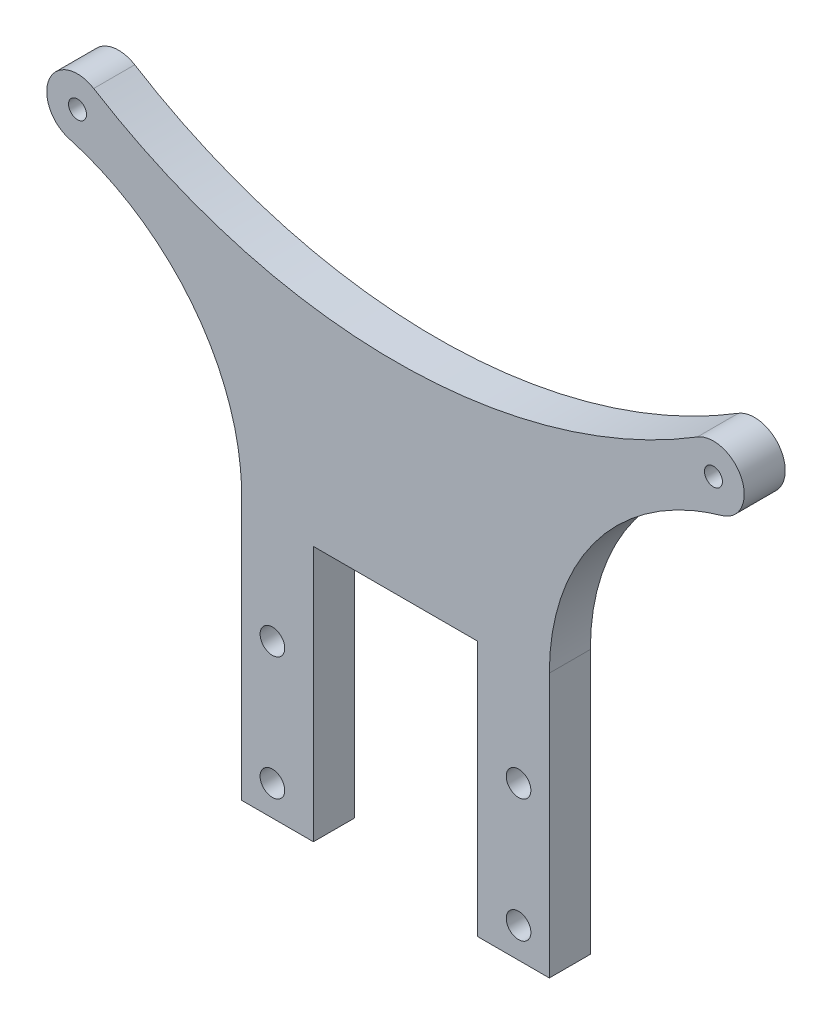
ISO-10303-21;
HEADER;
FILE_DESCRIPTION(('STEP AP214'),'2;1');
FILE_NAME('part.step','',(''),(''),'','','');
FILE_SCHEMA(('AUTOMOTIVE_DESIGN { 1 0 10303 214 1 1 1 1 }'));
ENDSEC;
DATA;
#1=APPLICATION_CONTEXT('core data for automotive mechanical design processes');
#2=APPLICATION_PROTOCOL_DEFINITION('international standard','automotive_design',2000,#1);
#3=PRODUCT_CONTEXT('',#1,'mechanical');
#4=PRODUCT('Part','Part','',(#3));
#5=PRODUCT_RELATED_PRODUCT_CATEGORY('part','',(#4));
#6=PRODUCT_DEFINITION_FORMATION('','',#4);
#7=PRODUCT_DEFINITION_CONTEXT('part definition',#1,'design');
#8=PRODUCT_DEFINITION('design','',#6,#7);
#9=PRODUCT_DEFINITION_SHAPE('','',#8);
#10=(LENGTH_UNIT() NAMED_UNIT(*) SI_UNIT(.MILLI.,.METRE.));
#11=(NAMED_UNIT(*) PLANE_ANGLE_UNIT() SI_UNIT($,.RADIAN.));
#12=(NAMED_UNIT(*) SI_UNIT($,.STERADIAN.) SOLID_ANGLE_UNIT());
#13=UNCERTAINTY_MEASURE_WITH_UNIT(LENGTH_MEASURE(1.E-05),#10,'distance_accuracy_value','');
#14=(GEOMETRIC_REPRESENTATION_CONTEXT(3) GLOBAL_UNCERTAINTY_ASSIGNED_CONTEXT((#13)) GLOBAL_UNIT_ASSIGNED_CONTEXT((#10,
#11,#12)) REPRESENTATION_CONTEXT('',''));
#15=CARTESIAN_POINT('',(0.,0.,0.));
#16=DIRECTION('',(0.,0.,1.));
#17=DIRECTION('',(1.,0.,0.));
#18=AXIS2_PLACEMENT_3D('',#15,#16,#17);
#19=CARTESIAN_POINT('',(-60.8178296691344,1.27,6.35));
#20=DIRECTION('',(0.,0.,-1.));
#21=DIRECTION('',(-1.,0.,0.));
#22=AXIS2_PLACEMENT_3D('',#19,#20,#21);
#23=PLANE('',#22);
#24=CARTESIAN_POINT('',(19.05,-34.925,6.35));
#25=DIRECTION('',(0.,0.,1.));
#26=DIRECTION('',(-1.,0.,0.));
#27=AXIS2_PLACEMENT_3D('',#24,#25,#26);
#28=CIRCLE('',#27,1.90499999999999);
#29=CARTESIAN_POINT('',(17.145,-34.925,6.35));
#30=VERTEX_POINT('',#29);
#31=EDGE_CURVE('E315',#30,#30,#28,.T.);
#32=ORIENTED_EDGE('',*,*,#31,.F.);
#33=EDGE_LOOP('',(#32));
#34=FACE_BOUND('',#33,.T.);
#35=CARTESIAN_POINT('',(-49.2125,40.3225,6.35));
#36=DIRECTION('',(0.,0.,1.));
#37=DIRECTION('',(1.,0.,0.));
#38=AXIS2_PLACEMENT_3D('',#35,#36,#37);
#39=CIRCLE('',#38,1.3890625);
#40=CARTESIAN_POINT('',(-47.8234375,40.3225,6.35));
#41=VERTEX_POINT('',#40);
#42=EDGE_CURVE('E303',#41,#41,#39,.T.);
#43=ORIENTED_EDGE('',*,*,#42,.F.);
#44=EDGE_LOOP('',(#43));
#45=FACE_BOUND('',#44,.T.);
#46=CARTESIAN_POINT('',(-19.05,-15.875,6.35));
#47=DIRECTION('',(0.,0.,1.));
#48=DIRECTION('',(1.,0.,0.));
#49=AXIS2_PLACEMENT_3D('',#46,#47,#48);
#50=CIRCLE('',#49,1.905);
#51=CARTESIAN_POINT('',(-17.145,-15.875,6.35));
#52=VERTEX_POINT('',#51);
#53=EDGE_CURVE('E159',#52,#52,#50,.T.);
#54=ORIENTED_EDGE('',*,*,#53,.F.);
#55=EDGE_LOOP('',(#54));
#56=FACE_BOUND('',#55,.T.);
#57=DIRECTION('',(0.,1.,0.));
#58=VECTOR('',#57,1.);
#59=CARTESIAN_POINT('',(-12.7,0.,6.35));
#60=LINE('',#59,#58);
#61=CARTESIAN_POINT('',(-12.7,-39.5938606465336,6.35));
#62=VERTEX_POINT('',#61);
#63=CARTESIAN_POINT('',(-12.7,0.,6.35));
#64=VERTEX_POINT('',#63);
#65=EDGE_CURVE('E179',#62,#64,#60,.T.);
#66=ORIENTED_EDGE('',*,*,#65,.T.);
#67=DIRECTION('',(1.,0.,0.));
#68=VECTOR('',#67,1.);
#69=CARTESIAN_POINT('',(12.7,0.,6.35));
#70=LINE('',#69,#68);
#71=CARTESIAN_POINT('',(12.7,0.,6.35));
#72=VERTEX_POINT('',#71);
#73=EDGE_CURVE('E105',#64,#72,#70,.T.);
#74=ORIENTED_EDGE('',*,*,#73,.T.);
#75=DIRECTION('',(0.,-1.,0.));
#76=VECTOR('',#75,1.);
#77=CARTESIAN_POINT('',(12.7,0.,6.35));
#78=LINE('',#77,#76);
#79=CARTESIAN_POINT('',(12.7,-39.5938606465336,6.35));
#80=VERTEX_POINT('',#79);
#81=EDGE_CURVE('E206',#72,#80,#78,.T.);
#82=ORIENTED_EDGE('',*,*,#81,.T.);
#83=DIRECTION('',(1.,0.,0.));
#84=VECTOR('',#83,1.);
#85=CARTESIAN_POINT('',(23.8125,-39.5938606465336,6.35));
#86=LINE('',#85,#84);
#87=CARTESIAN_POINT('',(23.8125,-39.5938606465336,6.35));
#88=VERTEX_POINT('',#87);
#89=EDGE_CURVE('E224',#80,#88,#86,.T.);
#90=ORIENTED_EDGE('',*,*,#89,.T.);
#91=DIRECTION('',(0.,1.,0.));
#92=VECTOR('',#91,1.);
#93=CARTESIAN_POINT('',(23.8125,-39.5938606465336,6.35));
#94=LINE('',#93,#92);
#95=CARTESIAN_POINT('',(23.8125,1.27000000000002,6.35));
#96=VERTEX_POINT('',#95);
#97=EDGE_CURVE('E221',#88,#96,#94,.T.);
#98=ORIENTED_EDGE('',*,*,#97,.T.);
#99=CARTESIAN_POINT('',(60.8178296691344,1.27000000000003,6.35));
#100=DIRECTION('',(0.,0.,-1.));
#101=DIRECTION('',(-1.,0.,0.));
#102=AXIS2_PLACEMENT_3D('',#99,#100,#101);
#103=ELLIPSE('',#102,37.0053296691344,35.8906348104381);
#104=CARTESIAN_POINT('',(50.5029869280307,35.7381734694634,6.35));
#105=VERTEX_POINT('',#104);
#106=EDGE_CURVE('E223',#96,#105,#103,.T.);
#107=ORIENTED_EDGE('',*,*,#106,.T.);
#108=CARTESIAN_POINT('',(49.2125,40.3225,6.35));
#109=DIRECTION('',(0.,0.,1.));
#110=DIRECTION('',(-1.,0.,0.));
#111=AXIS2_PLACEMENT_3D('',#108,#109,#110);
#112=CIRCLE('',#111,4.76250000000001);
#113=CARTESIAN_POINT('',(46.7102658795886,44.3746883787219,6.35));
#114=VERTEX_POINT('',#113);
#115=EDGE_CURVE('E226',#105,#114,#112,.T.);
#116=ORIENTED_EDGE('',*,*,#115,.T.);
#117=CARTESIAN_POINT('',(0.,120.018607954545,6.35));
#118=DIRECTION('',(0.,0.,-1.));
#119=DIRECTION('',(-1.,0.,0.));
#120=AXIS2_PLACEMENT_3D('',#117,#118,#119);
#121=CIRCLE('',#120,88.9036079545454);
#122=CARTESIAN_POINT('',(-46.7102658795886,44.3746883787219,6.35));
#123=VERTEX_POINT('',#122);
#124=EDGE_CURVE('E490',#114,#123,#121,.T.);
#125=ORIENTED_EDGE('',*,*,#124,.T.);
#126=CARTESIAN_POINT('',(-49.2125,40.3225,6.35));
#127=DIRECTION('',(0.,0.,1.));
#128=DIRECTION('',(1.,0.,0.));
#129=AXIS2_PLACEMENT_3D('',#126,#127,#128);
#130=CIRCLE('',#129,4.76250000000002);
#131=CARTESIAN_POINT('',(-50.5029869280307,35.7381734694634,6.35));
#132=VERTEX_POINT('',#131);
#133=EDGE_CURVE('E136',#123,#132,#130,.T.);
#134=ORIENTED_EDGE('',*,*,#133,.T.);
#135=CARTESIAN_POINT('',(-60.8178296691344,1.27,6.35));
#136=DIRECTION('',(0.,0.,-1.));
#137=DIRECTION('',(1.,0.,0.));
#138=AXIS2_PLACEMENT_3D('',#135,#136,#137);
#139=ELLIPSE('',#138,37.0053296691344,35.8906348104381);
#140=CARTESIAN_POINT('',(-23.8125,1.27,6.35));
#141=VERTEX_POINT('',#140);
#142=EDGE_CURVE('E130',#132,#141,#139,.T.);
#143=ORIENTED_EDGE('',*,*,#142,.T.);
#144=DIRECTION('',(0.,-1.,0.));
#145=VECTOR('',#144,1.);
#146=CARTESIAN_POINT('',(-23.8125,-39.5938606465336,6.35));
#147=LINE('',#146,#145);
#148=CARTESIAN_POINT('',(-23.8125,-39.5938606465336,6.35));
#149=VERTEX_POINT('',#148);
#150=EDGE_CURVE('E134',#141,#149,#147,.T.);
#151=ORIENTED_EDGE('',*,*,#150,.T.);
#152=DIRECTION('',(1.,0.,0.));
#153=VECTOR('',#152,1.);
#154=CARTESIAN_POINT('',(-23.8125,-39.5938606465336,6.35));
#155=LINE('',#154,#153);
#156=EDGE_CURVE('E50',#149,#62,#155,.T.);
#157=ORIENTED_EDGE('',*,*,#156,.T.);
#158=EDGE_LOOP('',(#66,#74,#82,#90,#98,#107,#116,#125,#134,#143,#151,#157));
#159=FACE_BOUND('',#158,.T.);
#160=CARTESIAN_POINT('',(19.05,-15.875,6.35));
#161=DIRECTION('',(0.,0.,1.));
#162=DIRECTION('',(-1.,0.,0.));
#163=AXIS2_PLACEMENT_3D('',#160,#161,#162);
#164=CIRCLE('',#163,1.905);
#165=CARTESIAN_POINT('',(17.145,-15.875,6.35));
#166=VERTEX_POINT('',#165);
#167=EDGE_CURVE('E297',#166,#166,#164,.T.);
#168=ORIENTED_EDGE('',*,*,#167,.F.);
#169=EDGE_LOOP('',(#168));
#170=FACE_BOUND('',#169,.T.);
#171=CARTESIAN_POINT('',(-19.05,-34.925,6.35));
#172=DIRECTION('',(0.,0.,1.));
#173=DIRECTION('',(1.,0.,0.));
#174=AXIS2_PLACEMENT_3D('',#171,#172,#173);
#175=CIRCLE('',#174,1.905);
#176=CARTESIAN_POINT('',(-17.145,-34.925,6.35));
#177=VERTEX_POINT('',#176);
#178=EDGE_CURVE('E309',#177,#177,#175,.T.);
#179=ORIENTED_EDGE('',*,*,#178,.F.);
#180=EDGE_LOOP('',(#179));
#181=FACE_BOUND('',#180,.T.);
#182=CARTESIAN_POINT('',(49.2125,40.3225,6.35));
#183=DIRECTION('',(0.,0.,1.));
#184=DIRECTION('',(-1.,0.,0.));
#185=AXIS2_PLACEMENT_3D('',#182,#183,#184);
#186=CIRCLE('',#185,1.3890625);
#187=CARTESIAN_POINT('',(47.8234375,40.3225,6.35));
#188=VERTEX_POINT('',#187);
#189=EDGE_CURVE('E321',#188,#188,#186,.T.);
#190=ORIENTED_EDGE('',*,*,#189,.F.);
#191=EDGE_LOOP('',(#190));
#192=FACE_BOUND('',#191,.T.);
#193=ADVANCED_FACE('F33',(#34,#45,#56,#159,#170,#181,#192),#23,.F.);
#194=CARTESIAN_POINT('',(-60.8178296691344,1.27,0.));
#195=DIRECTION('',(0.,0.,-1.));
#196=DIRECTION('',(-1.,0.,0.));
#197=AXIS2_PLACEMENT_3D('',#194,#195,#196);
#198=PLANE('',#197);
#199=CARTESIAN_POINT('',(19.05,-34.925,0.));
#200=DIRECTION('',(0.,0.,1.));
#201=DIRECTION('',(-1.,0.,0.));
#202=AXIS2_PLACEMENT_3D('',#199,#200,#201);
#203=CIRCLE('',#202,1.90499999999999);
#204=CARTESIAN_POINT('',(17.145,-34.925,0.));
#205=VERTEX_POINT('',#204);
#206=EDGE_CURVE('E318',#205,#205,#203,.T.);
#207=ORIENTED_EDGE('',*,*,#206,.T.);
#208=EDGE_LOOP('',(#207));
#209=FACE_BOUND('',#208,.T.);
#210=CARTESIAN_POINT('',(-49.2125,40.3225,0.));
#211=DIRECTION('',(0.,0.,1.));
#212=DIRECTION('',(1.,0.,0.));
#213=AXIS2_PLACEMENT_3D('',#210,#211,#212);
#214=CIRCLE('',#213,1.3890625);
#215=CARTESIAN_POINT('',(-47.8234375,40.3225,0.));
#216=VERTEX_POINT('',#215);
#217=EDGE_CURVE('E306',#216,#216,#214,.T.);
#218=ORIENTED_EDGE('',*,*,#217,.T.);
#219=EDGE_LOOP('',(#218));
#220=FACE_BOUND('',#219,.T.);
#221=CARTESIAN_POINT('',(-19.05,-15.875,0.));
#222=DIRECTION('',(0.,0.,1.));
#223=DIRECTION('',(1.,0.,0.));
#224=AXIS2_PLACEMENT_3D('',#221,#222,#223);
#225=CIRCLE('',#224,1.905);
#226=CARTESIAN_POINT('',(-17.145,-15.875,0.));
#227=VERTEX_POINT('',#226);
#228=EDGE_CURVE('E294',#227,#227,#225,.T.);
#229=ORIENTED_EDGE('',*,*,#228,.T.);
#230=EDGE_LOOP('',(#229));
#231=FACE_BOUND('',#230,.T.);
#232=DIRECTION('',(0.,1.,0.));
#233=VECTOR('',#232,1.);
#234=CARTESIAN_POINT('',(-12.7,0.,0.));
#235=LINE('',#234,#233);
#236=CARTESIAN_POINT('',(-12.7,-39.5938606465336,0.));
#237=VERTEX_POINT('',#236);
#238=CARTESIAN_POINT('',(-12.7,0.,0.));
#239=VERTEX_POINT('',#238);
#240=EDGE_CURVE('E155',#237,#239,#235,.T.);
#241=ORIENTED_EDGE('',*,*,#240,.F.);
#242=DIRECTION('',(1.,0.,0.));
#243=VECTOR('',#242,1.);
#244=CARTESIAN_POINT('',(-23.8125,-39.5938606465336,0.));
#245=LINE('',#244,#243);
#246=CARTESIAN_POINT('',(-23.8125,-39.5938606465336,0.));
#247=VERTEX_POINT('',#246);
#248=EDGE_CURVE('E97',#247,#237,#245,.T.);
#249=ORIENTED_EDGE('',*,*,#248,.F.);
#250=DIRECTION('',(0.,-1.,0.));
#251=VECTOR('',#250,1.);
#252=CARTESIAN_POINT('',(-23.8125,-39.5938606465336,0.));
#253=LINE('',#252,#251);
#254=CARTESIAN_POINT('',(-23.8125,1.27,0.));
#255=VERTEX_POINT('',#254);
#256=EDGE_CURVE('E91',#255,#247,#253,.T.);
#257=ORIENTED_EDGE('',*,*,#256,.F.);
#258=CARTESIAN_POINT('',(-60.8178296691344,1.27,0.));
#259=DIRECTION('',(0.,0.,-1.));
#260=DIRECTION('',(1.,0.,0.));
#261=AXIS2_PLACEMENT_3D('',#258,#259,#260);
#262=ELLIPSE('',#261,37.0053296691344,35.8906348104381);
#263=CARTESIAN_POINT('',(-50.5029869280307,35.7381734694634,0.));
#264=VERTEX_POINT('',#263);
#265=EDGE_CURVE('E144',#264,#255,#262,.T.);
#266=ORIENTED_EDGE('',*,*,#265,.F.);
#267=CARTESIAN_POINT('',(-49.2125,40.3225,0.));
#268=DIRECTION('',(0.,0.,1.));
#269=DIRECTION('',(1.,0.,0.));
#270=AXIS2_PLACEMENT_3D('',#267,#268,#269);
#271=CIRCLE('',#270,4.76250000000002);
#272=CARTESIAN_POINT('',(-46.7102658795886,44.3746883787219,0.));
#273=VERTEX_POINT('',#272);
#274=EDGE_CURVE('E174',#273,#264,#271,.T.);
#275=ORIENTED_EDGE('',*,*,#274,.F.);
#276=CARTESIAN_POINT('',(0.,120.018607954545,0.));
#277=DIRECTION('',(0.,0.,-1.));
#278=DIRECTION('',(-1.,0.,0.));
#279=AXIS2_PLACEMENT_3D('',#276,#277,#278);
#280=CIRCLE('',#279,88.9036079545454);
#281=CARTESIAN_POINT('',(46.7102658795886,44.3746883787219,0.));
#282=VERTEX_POINT('',#281);
#283=EDGE_CURVE('E172',#282,#273,#280,.T.);
#284=ORIENTED_EDGE('',*,*,#283,.F.);
#285=CARTESIAN_POINT('',(49.2125,40.3225,0.));
#286=DIRECTION('',(0.,0.,1.));
#287=DIRECTION('',(-1.,0.,0.));
#288=AXIS2_PLACEMENT_3D('',#285,#286,#287);
#289=CIRCLE('',#288,4.76250000000001);
#290=CARTESIAN_POINT('',(50.5029869280307,35.7381734694634,0.));
#291=VERTEX_POINT('',#290);
#292=EDGE_CURVE('E170',#291,#282,#289,.T.);
#293=ORIENTED_EDGE('',*,*,#292,.F.);
#294=CARTESIAN_POINT('',(60.8178296691344,1.27000000000003,0.));
#295=DIRECTION('',(0.,0.,-1.));
#296=DIRECTION('',(-1.,0.,0.));
#297=AXIS2_PLACEMENT_3D('',#294,#295,#296);
#298=ELLIPSE('',#297,37.0053296691344,35.8906348104381);
#299=CARTESIAN_POINT('',(23.8125,1.27000000000002,0.));
#300=VERTEX_POINT('',#299);
#301=EDGE_CURVE('E168',#300,#291,#298,.T.);
#302=ORIENTED_EDGE('',*,*,#301,.F.);
#303=DIRECTION('',(0.,1.,0.));
#304=VECTOR('',#303,1.);
#305=CARTESIAN_POINT('',(23.8125,-5.07999999999998,0.));
#306=LINE('',#305,#304);
#307=CARTESIAN_POINT('',(23.8125,-39.5938606465336,0.));
#308=VERTEX_POINT('',#307);
#309=EDGE_CURVE('E166',#308,#300,#306,.T.);
#310=ORIENTED_EDGE('',*,*,#309,.F.);
#311=DIRECTION('',(1.,0.,0.));
#312=VECTOR('',#311,1.);
#313=CARTESIAN_POINT('',(23.8125,-39.5938606465336,0.));
#314=LINE('',#313,#312);
#315=CARTESIAN_POINT('',(12.7,-39.5938606465336,0.));
#316=VERTEX_POINT('',#315);
#317=EDGE_CURVE('E163',#316,#308,#314,.T.);
#318=ORIENTED_EDGE('',*,*,#317,.F.);
#319=DIRECTION('',(0.,-1.,0.));
#320=VECTOR('',#319,1.);
#321=CARTESIAN_POINT('',(12.7,0.,0.));
#322=LINE('',#321,#320);
#323=CARTESIAN_POINT('',(12.7,0.,0.));
#324=VERTEX_POINT('',#323);
#325=EDGE_CURVE('E161',#324,#316,#322,.T.);
#326=ORIENTED_EDGE('',*,*,#325,.F.);
#327=DIRECTION('',(1.,0.,0.));
#328=VECTOR('',#327,1.);
#329=CARTESIAN_POINT('',(12.7,0.,0.));
#330=LINE('',#329,#328);
#331=EDGE_CURVE('E158',#239,#324,#330,.T.);
#332=ORIENTED_EDGE('',*,*,#331,.F.);
#333=EDGE_LOOP('',(#241,#249,#257,#266,#275,#284,#293,#302,#310,#318,#326,#332));
#334=FACE_BOUND('',#333,.T.);
#335=CARTESIAN_POINT('',(19.05,-15.875,0.));
#336=DIRECTION('',(0.,0.,1.));
#337=DIRECTION('',(-1.,0.,0.));
#338=AXIS2_PLACEMENT_3D('',#335,#336,#337);
#339=CIRCLE('',#338,1.905);
#340=CARTESIAN_POINT('',(17.145,-15.875,0.));
#341=VERTEX_POINT('',#340);
#342=EDGE_CURVE('E300',#341,#341,#339,.T.);
#343=ORIENTED_EDGE('',*,*,#342,.T.);
#344=EDGE_LOOP('',(#343));
#345=FACE_BOUND('',#344,.T.);
#346=CARTESIAN_POINT('',(-19.05,-34.925,0.));
#347=DIRECTION('',(0.,0.,1.));
#348=DIRECTION('',(1.,0.,0.));
#349=AXIS2_PLACEMENT_3D('',#346,#347,#348);
#350=CIRCLE('',#349,1.905);
#351=CARTESIAN_POINT('',(-17.145,-34.925,0.));
#352=VERTEX_POINT('',#351);
#353=EDGE_CURVE('E312',#352,#352,#350,.T.);
#354=ORIENTED_EDGE('',*,*,#353,.T.);
#355=EDGE_LOOP('',(#354));
#356=FACE_BOUND('',#355,.T.);
#357=CARTESIAN_POINT('',(49.2125,40.3225,0.));
#358=DIRECTION('',(0.,0.,1.));
#359=DIRECTION('',(-1.,0.,0.));
#360=AXIS2_PLACEMENT_3D('',#357,#358,#359);
#361=CIRCLE('',#360,1.3890625);
#362=CARTESIAN_POINT('',(47.8234375,40.3225,0.));
#363=VERTEX_POINT('',#362);
#364=EDGE_CURVE('E324',#363,#363,#361,.T.);
#365=ORIENTED_EDGE('',*,*,#364,.T.);
#366=EDGE_LOOP('',(#365));
#367=FACE_BOUND('',#366,.T.);
#368=ADVANCED_FACE('F210',(#209,#220,#231,#334,#345,#356,#367),#198,.T.);
#369=CARTESIAN_POINT('',(-12.7,0.,6.35));
#370=DIRECTION('',(-1.,0.,0.));
#371=DIRECTION('',(0.,0.,1.));
#372=AXIS2_PLACEMENT_3D('',#369,#370,#371);
#373=PLANE('',#372);
#374=ORIENTED_EDGE('',*,*,#240,.T.);
#375=DIRECTION('',(0.,0.,-1.));
#376=VECTOR('',#375,1.);
#377=CARTESIAN_POINT('',(-12.7,0.,6.35));
#378=LINE('',#377,#376);
#379=EDGE_CURVE('E11',#64,#239,#378,.T.);
#380=ORIENTED_EDGE('',*,*,#379,.F.);
#381=ORIENTED_EDGE('',*,*,#65,.F.);
#382=DIRECTION('',(0.,0.,-1.));
#383=VECTOR('',#382,1.);
#384=CARTESIAN_POINT('',(-12.7,-39.5938606465336,6.35));
#385=LINE('',#384,#383);
#386=EDGE_CURVE('E150',#62,#237,#385,.T.);
#387=ORIENTED_EDGE('',*,*,#386,.T.);
#388=EDGE_LOOP('',(#374,#380,#381,#387));
#389=FACE_BOUND('',#388,.T.);
#390=ADVANCED_FACE('F35',(#389),#373,.F.);
#391=CARTESIAN_POINT('',(12.7,0.,6.35));
#392=DIRECTION('',(0.,1.,0.));
#393=DIRECTION('',(-1.,0.,0.));
#394=AXIS2_PLACEMENT_3D('',#391,#392,#393);
#395=PLANE('',#394);
#396=ORIENTED_EDGE('',*,*,#331,.T.);
#397=DIRECTION('',(0.,0.,-1.));
#398=VECTOR('',#397,1.);
#399=CARTESIAN_POINT('',(12.7,0.,6.35));
#400=LINE('',#399,#398);
#401=EDGE_CURVE('E42',#72,#324,#400,.T.);
#402=ORIENTED_EDGE('',*,*,#401,.F.);
#403=ORIENTED_EDGE('',*,*,#73,.F.);
#404=ORIENTED_EDGE('',*,*,#379,.T.);
#405=EDGE_LOOP('',(#396,#402,#403,#404));
#406=FACE_BOUND('',#405,.T.);
#407=ADVANCED_FACE('F246',(#406),#395,.F.);
#408=CARTESIAN_POINT('',(12.7,0.,6.35));
#409=DIRECTION('',(1.,0.,0.));
#410=DIRECTION('',(0.,0.,-1.));
#411=AXIS2_PLACEMENT_3D('',#408,#409,#410);
#412=PLANE('',#411);
#413=ORIENTED_EDGE('',*,*,#325,.T.);
#414=DIRECTION('',(0.,0.,-1.));
#415=VECTOR('',#414,1.);
#416=CARTESIAN_POINT('',(12.7,-39.5938606465336,6.35));
#417=LINE('',#416,#415);
#418=EDGE_CURVE('E198',#80,#316,#417,.T.);
#419=ORIENTED_EDGE('',*,*,#418,.F.);
#420=ORIENTED_EDGE('',*,*,#81,.F.);
#421=ORIENTED_EDGE('',*,*,#401,.T.);
#422=EDGE_LOOP('',(#413,#419,#420,#421));
#423=FACE_BOUND('',#422,.T.);
#424=ADVANCED_FACE('F204',(#423),#412,.F.);
#425=CARTESIAN_POINT('',(23.8125,-39.5938606465336,6.35));
#426=DIRECTION('',(0.,1.,0.));
#427=DIRECTION('',(0.,0.,1.));
#428=AXIS2_PLACEMENT_3D('',#425,#426,#427);
#429=PLANE('',#428);
#430=ORIENTED_EDGE('',*,*,#317,.T.);
#431=DIRECTION('',(0.,0.,-1.));
#432=VECTOR('',#431,1.);
#433=CARTESIAN_POINT('',(23.8125,-39.5938606465336,6.35));
#434=LINE('',#433,#432);
#435=EDGE_CURVE('E195',#88,#308,#434,.T.);
#436=ORIENTED_EDGE('',*,*,#435,.F.);
#437=ORIENTED_EDGE('',*,*,#89,.F.);
#438=ORIENTED_EDGE('',*,*,#418,.T.);
#439=EDGE_LOOP('',(#430,#436,#437,#438));
#440=FACE_BOUND('',#439,.T.);
#441=ADVANCED_FACE('F215',(#440),#429,.F.);
#442=CARTESIAN_POINT('',(23.8125,-5.07999999999998,6.35));
#443=DIRECTION('',(-1.,0.,0.));
#444=DIRECTION('',(0.,-1.,0.));
#445=AXIS2_PLACEMENT_3D('',#442,#443,#444);
#446=PLANE('',#445);
#447=ORIENTED_EDGE('',*,*,#309,.T.);
#448=DIRECTION('',(0.,0.,-1.));
#449=VECTOR('',#448,1.);
#450=CARTESIAN_POINT('',(23.8125,1.27000000000002,6.35));
#451=LINE('',#450,#449);
#452=EDGE_CURVE('E192',#96,#300,#451,.T.);
#453=ORIENTED_EDGE('',*,*,#452,.F.);
#454=ORIENTED_EDGE('',*,*,#97,.F.);
#455=ORIENTED_EDGE('',*,*,#435,.T.);
#456=EDGE_LOOP('',(#447,#453,#454,#455));
#457=FACE_BOUND('',#456,.T.);
#458=ADVANCED_FACE('F219',(#457),#446,.F.);
#459=DIRECTION('',(0.,0.,-1.));
#460=VECTOR('',#459,1.);
#461=SURFACE_OF_LINEAR_EXTRUSION('',#103,#460);
#462=ORIENTED_EDGE('',*,*,#301,.T.);
#463=DIRECTION('',(0.,0.,-1.));
#464=VECTOR('',#463,1.);
#465=CARTESIAN_POINT('',(50.5029869280307,35.7381734694634,6.35));
#466=LINE('',#465,#464);
#467=EDGE_CURVE('E189',#105,#291,#466,.T.);
#468=ORIENTED_EDGE('',*,*,#467,.F.);
#469=ORIENTED_EDGE('',*,*,#106,.F.);
#470=ORIENTED_EDGE('',*,*,#452,.T.);
#471=EDGE_LOOP('',(#462,#468,#469,#470));
#472=FACE_BOUND('',#471,.T.);
#473=ADVANCED_FACE('F234',(#472),#461,.F.);
#474=CARTESIAN_POINT('',(49.2125,40.3225,6.35));
#475=DIRECTION('',(0.,0.,-1.));
#476=DIRECTION('',(-1.,0.,0.));
#477=AXIS2_PLACEMENT_3D('',#474,#475,#476);
#478=CYLINDRICAL_SURFACE('',#477,4.76250000000001);
#479=ORIENTED_EDGE('',*,*,#292,.T.);
#480=DIRECTION('',(0.,0.,-1.));
#481=VECTOR('',#480,1.);
#482=CARTESIAN_POINT('',(46.7102658795886,44.3746883787219,6.35));
#483=LINE('',#482,#481);
#484=EDGE_CURVE('E186',#114,#282,#483,.T.);
#485=ORIENTED_EDGE('',*,*,#484,.F.);
#486=ORIENTED_EDGE('',*,*,#115,.F.);
#487=ORIENTED_EDGE('',*,*,#467,.T.);
#488=EDGE_LOOP('',(#479,#485,#486,#487));
#489=FACE_BOUND('',#488,.T.);
#490=ADVANCED_FACE('F238',(#489),#478,.T.);
#491=CARTESIAN_POINT('',(0.,120.018607954545,6.35));
#492=DIRECTION('',(0.,0.,-1.));
#493=DIRECTION('',(-1.,0.,0.));
#494=AXIS2_PLACEMENT_3D('',#491,#492,#493);
#495=CYLINDRICAL_SURFACE('',#494,88.9036079545454);
#496=ORIENTED_EDGE('',*,*,#283,.T.);
#497=DIRECTION('',(0.,0.,-1.));
#498=VECTOR('',#497,1.);
#499=CARTESIAN_POINT('',(-46.7102658795886,44.3746883787219,6.35));
#500=LINE('',#499,#498);
#501=EDGE_CURVE('E183',#123,#273,#500,.T.);
#502=ORIENTED_EDGE('',*,*,#501,.F.);
#503=ORIENTED_EDGE('',*,*,#124,.F.);
#504=ORIENTED_EDGE('',*,*,#484,.T.);
#505=EDGE_LOOP('',(#496,#502,#503,#504));
#506=FACE_BOUND('',#505,.T.);
#507=ADVANCED_FACE('F275',(#506),#495,.F.);
#508=CARTESIAN_POINT('',(-49.2125,40.3225,6.35));
#509=DIRECTION('',(0.,0.,-1.));
#510=DIRECTION('',(-1.,0.,0.));
#511=AXIS2_PLACEMENT_3D('',#508,#509,#510);
#512=CYLINDRICAL_SURFACE('',#511,4.76250000000002);
#513=ORIENTED_EDGE('',*,*,#274,.T.);
#514=DIRECTION('',(0.,0.,-1.));
#515=VECTOR('',#514,1.);
#516=CARTESIAN_POINT('',(-50.5029869280307,35.7381734694634,6.35));
#517=LINE('',#516,#515);
#518=EDGE_CURVE('E145',#132,#264,#517,.T.);
#519=ORIENTED_EDGE('',*,*,#518,.F.);
#520=ORIENTED_EDGE('',*,*,#133,.F.);
#521=ORIENTED_EDGE('',*,*,#501,.T.);
#522=EDGE_LOOP('',(#513,#519,#520,#521));
#523=FACE_BOUND('',#522,.T.);
#524=ADVANCED_FACE('F273',(#523),#512,.T.);
#525=DIRECTION('',(0.,0.,-1.));
#526=VECTOR('',#525,1.);
#527=SURFACE_OF_LINEAR_EXTRUSION('',#139,#526);
#528=ORIENTED_EDGE('',*,*,#265,.T.);
#529=DIRECTION('',(0.,0.,-1.));
#530=VECTOR('',#529,1.);
#531=CARTESIAN_POINT('',(-23.8125,1.27,6.35));
#532=LINE('',#531,#530);
#533=EDGE_CURVE('E141',#141,#255,#532,.T.);
#534=ORIENTED_EDGE('',*,*,#533,.F.);
#535=ORIENTED_EDGE('',*,*,#142,.F.);
#536=ORIENTED_EDGE('',*,*,#518,.T.);
#537=EDGE_LOOP('',(#528,#534,#535,#536));
#538=FACE_BOUND('',#537,.T.);
#539=ADVANCED_FACE('F142',(#538),#527,.F.);
#540=CARTESIAN_POINT('',(-23.8125,-39.5938606465336,6.35));
#541=DIRECTION('',(1.,0.,0.));
#542=DIRECTION('',(0.,0.,-1.));
#543=AXIS2_PLACEMENT_3D('',#540,#541,#542);
#544=PLANE('',#543);
#545=ORIENTED_EDGE('',*,*,#256,.T.);
#546=DIRECTION('',(0.,0.,-1.));
#547=VECTOR('',#546,1.);
#548=CARTESIAN_POINT('',(-23.8125,-39.5938606465336,6.35));
#549=LINE('',#548,#547);
#550=EDGE_CURVE('E146',#149,#247,#549,.T.);
#551=ORIENTED_EDGE('',*,*,#550,.F.);
#552=ORIENTED_EDGE('',*,*,#150,.F.);
#553=ORIENTED_EDGE('',*,*,#533,.T.);
#554=EDGE_LOOP('',(#545,#551,#552,#553));
#555=FACE_BOUND('',#554,.T.);
#556=ADVANCED_FACE('F148',(#555),#544,.F.);
#557=CARTESIAN_POINT('',(-23.8125,-39.5938606465336,6.35));
#558=DIRECTION('',(0.,1.,0.));
#559=DIRECTION('',(0.,0.,1.));
#560=AXIS2_PLACEMENT_3D('',#557,#558,#559);
#561=PLANE('',#560);
#562=ORIENTED_EDGE('',*,*,#248,.T.);
#563=ORIENTED_EDGE('',*,*,#386,.F.);
#564=ORIENTED_EDGE('',*,*,#156,.F.);
#565=ORIENTED_EDGE('',*,*,#550,.T.);
#566=EDGE_LOOP('',(#562,#563,#564,#565));
#567=FACE_BOUND('',#566,.T.);
#568=ADVANCED_FACE('F266',(#567),#561,.F.);
#569=CARTESIAN_POINT('',(-19.05,-15.875,6.35));
#570=DIRECTION('',(0.,0.,-1.));
#571=DIRECTION('',(-1.,0.,0.));
#572=AXIS2_PLACEMENT_3D('',#569,#570,#571);
#573=CYLINDRICAL_SURFACE('',#572,1.905);
#574=ORIENTED_EDGE('',*,*,#53,.T.);
#575=EDGE_LOOP('',(#574));
#576=FACE_BOUND('',#575,.T.);
#577=ORIENTED_EDGE('',*,*,#228,.F.);
#578=EDGE_LOOP('',(#577));
#579=FACE_BOUND('',#578,.T.);
#580=ADVANCED_FACE('F263',(#576,#579),#573,.F.);
#581=CARTESIAN_POINT('',(19.05,-15.875,6.35));
#582=DIRECTION('',(0.,0.,-1.));
#583=DIRECTION('',(-1.,0.,0.));
#584=AXIS2_PLACEMENT_3D('',#581,#582,#583);
#585=CYLINDRICAL_SURFACE('',#584,1.905);
#586=ORIENTED_EDGE('',*,*,#167,.T.);
#587=EDGE_LOOP('',(#586));
#588=FACE_BOUND('',#587,.T.);
#589=ORIENTED_EDGE('',*,*,#342,.F.);
#590=EDGE_LOOP('',(#589));
#591=FACE_BOUND('',#590,.T.);
#592=ADVANCED_FACE('F350',(#588,#591),#585,.F.);
#593=CARTESIAN_POINT('',(-49.2125,40.3225,6.35));
#594=DIRECTION('',(0.,0.,-1.));
#595=DIRECTION('',(-1.,0.,0.));
#596=AXIS2_PLACEMENT_3D('',#593,#594,#595);
#597=CYLINDRICAL_SURFACE('',#596,1.3890625);
#598=ORIENTED_EDGE('',*,*,#42,.T.);
#599=EDGE_LOOP('',(#598));
#600=FACE_BOUND('',#599,.T.);
#601=ORIENTED_EDGE('',*,*,#217,.F.);
#602=EDGE_LOOP('',(#601));
#603=FACE_BOUND('',#602,.T.);
#604=ADVANCED_FACE('F347',(#600,#603),#597,.F.);
#605=CARTESIAN_POINT('',(-19.05,-34.925,6.35));
#606=DIRECTION('',(0.,0.,-1.));
#607=DIRECTION('',(-1.,0.,0.));
#608=AXIS2_PLACEMENT_3D('',#605,#606,#607);
#609=CYLINDRICAL_SURFACE('',#608,1.905);
#610=ORIENTED_EDGE('',*,*,#178,.T.);
#611=EDGE_LOOP('',(#610));
#612=FACE_BOUND('',#611,.T.);
#613=ORIENTED_EDGE('',*,*,#353,.F.);
#614=EDGE_LOOP('',(#613));
#615=FACE_BOUND('',#614,.T.);
#616=ADVANCED_FACE('F341',(#612,#615),#609,.F.);
#617=CARTESIAN_POINT('',(19.05,-34.925,6.35));
#618=DIRECTION('',(0.,0.,-1.));
#619=DIRECTION('',(-1.,0.,0.));
#620=AXIS2_PLACEMENT_3D('',#617,#618,#619);
#621=CYLINDRICAL_SURFACE('',#620,1.90499999999999);
#622=ORIENTED_EDGE('',*,*,#31,.T.);
#623=EDGE_LOOP('',(#622));
#624=FACE_BOUND('',#623,.T.);
#625=ORIENTED_EDGE('',*,*,#206,.F.);
#626=EDGE_LOOP('',(#625));
#627=FACE_BOUND('',#626,.T.);
#628=ADVANCED_FACE('F334',(#624,#627),#621,.F.);
#629=CARTESIAN_POINT('',(49.2125,40.3225,6.35));
#630=DIRECTION('',(0.,0.,-1.));
#631=DIRECTION('',(-1.,0.,0.));
#632=AXIS2_PLACEMENT_3D('',#629,#630,#631);
#633=CYLINDRICAL_SURFACE('',#632,1.3890625);
#634=ORIENTED_EDGE('',*,*,#189,.T.);
#635=EDGE_LOOP('',(#634));
#636=FACE_BOUND('',#635,.T.);
#637=ORIENTED_EDGE('',*,*,#364,.F.);
#638=EDGE_LOOP('',(#637));
#639=FACE_BOUND('',#638,.T.);
#640=ADVANCED_FACE('F330',(#636,#639),#633,.F.);
#641=CLOSED_SHELL('',(#193,#368,#390,#407,#424,#441,#458,#473,#490,#507,#524,#539,#556,#568,
#580,#592,#604,#616,#628,#640));
#642=MANIFOLD_SOLID_BREP('B2',#641);
#643=ADVANCED_BREP_SHAPE_REPRESENTATION('',(#18,#642),#14);
#644=SHAPE_DEFINITION_REPRESENTATION(#9,#643);
ENDSEC;
END-ISO-10303-21;
